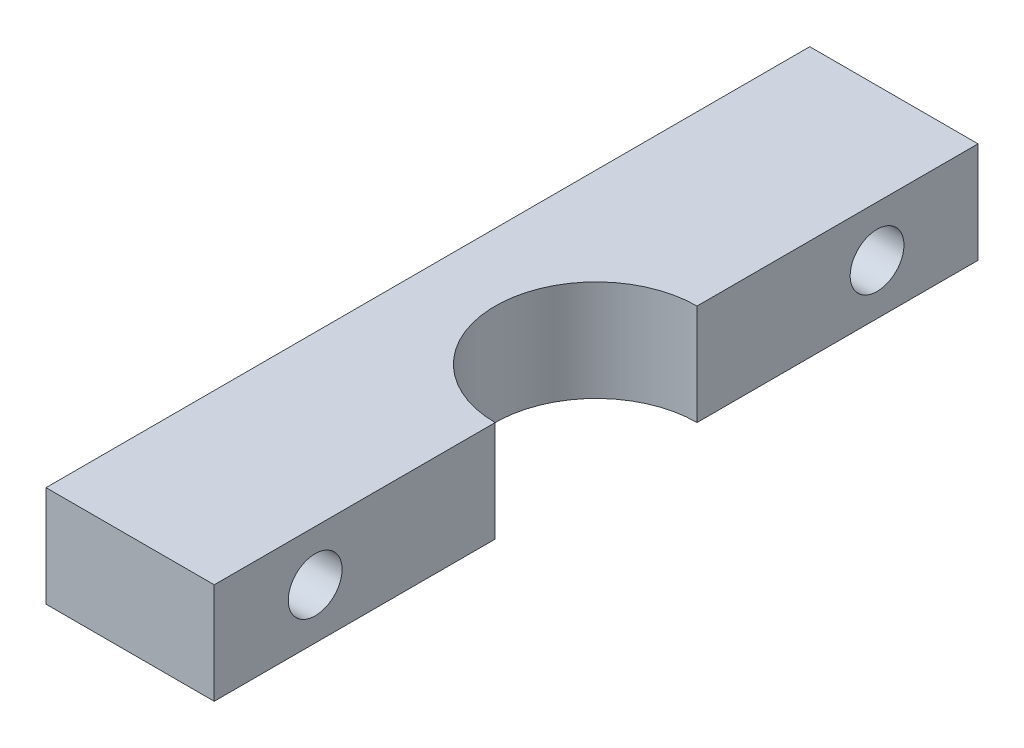
ISO-10303-21;
HEADER;
FILE_DESCRIPTION(('STEP AP214'),'2;1');
FILE_NAME('part.step','',(''),(''),'','','');
FILE_SCHEMA(('AUTOMOTIVE_DESIGN { 1 0 10303 214 1 1 1 1 }'));
ENDSEC;
DATA;
#1=APPLICATION_CONTEXT('core data for automotive mechanical design processes');
#2=APPLICATION_PROTOCOL_DEFINITION('international standard','automotive_design',2000,#1);
#3=PRODUCT_CONTEXT('',#1,'mechanical');
#4=PRODUCT('Part','Part','',(#3));
#5=PRODUCT_RELATED_PRODUCT_CATEGORY('part','',(#4));
#6=PRODUCT_DEFINITION_FORMATION('','',#4);
#7=PRODUCT_DEFINITION_CONTEXT('part definition',#1,'design');
#8=PRODUCT_DEFINITION('design','',#6,#7);
#9=PRODUCT_DEFINITION_SHAPE('','',#8);
#10=(LENGTH_UNIT() NAMED_UNIT(*) SI_UNIT(.MILLI.,.METRE.));
#11=(NAMED_UNIT(*) PLANE_ANGLE_UNIT() SI_UNIT($,.RADIAN.));
#12=(NAMED_UNIT(*) SI_UNIT($,.STERADIAN.) SOLID_ANGLE_UNIT());
#13=UNCERTAINTY_MEASURE_WITH_UNIT(LENGTH_MEASURE(1.E-05),#10,'distance_accuracy_value','');
#14=(GEOMETRIC_REPRESENTATION_CONTEXT(3) GLOBAL_UNCERTAINTY_ASSIGNED_CONTEXT((#13)) GLOBAL_UNIT_ASSIGNED_CONTEXT((#10,
#11,#12)) REPRESENTATION_CONTEXT('',''));
#15=CARTESIAN_POINT('',(0.,0.,0.));
#16=DIRECTION('',(0.,0.,1.));
#17=DIRECTION('',(1.,0.,0.));
#18=AXIS2_PLACEMENT_3D('',#15,#16,#17);
#19=CARTESIAN_POINT('',(0.,6.,0.));
#20=DIRECTION('',(1.,0.,0.));
#21=DIRECTION('',(0.,0.,-1.));
#22=AXIS2_PLACEMENT_3D('',#19,#20,#21);
#23=PLANE('',#22);
#24=CARTESIAN_POINT('',(0.,3.,-6.));
#25=DIRECTION('',(-1.,0.,0.));
#26=DIRECTION('',(0.,0.,1.));
#27=AXIS2_PLACEMENT_3D('',#24,#25,#26);
#28=CIRCLE('',#27,1.59999999999999);
#29=CARTESIAN_POINT('',(0.,3.,-4.40000000000001));
#30=VERTEX_POINT('',#29);
#31=EDGE_CURVE('E165',#30,#30,#28,.T.);
#32=ORIENTED_EDGE('',*,*,#31,.F.);
#33=EDGE_LOOP('',(#32));
#34=FACE_BOUND('',#33,.T.);
#35=DIRECTION('',(0.,0.,1.));
#36=VECTOR('',#35,1.);
#37=CARTESIAN_POINT('',(0.,0.,0.));
#38=LINE('',#37,#36);
#39=CARTESIAN_POINT('',(0.,0.,-45.4));
#40=VERTEX_POINT('',#39);
#41=CARTESIAN_POINT('',(0.,0.,0.));
#42=VERTEX_POINT('',#41);
#43=EDGE_CURVE('E121',#40,#42,#38,.T.);
#44=ORIENTED_EDGE('',*,*,#43,.T.);
#45=DIRECTION('',(0.,-1.,0.));
#46=VECTOR('',#45,1.);
#47=CARTESIAN_POINT('',(0.,6.,0.));
#48=LINE('',#47,#46);
#49=CARTESIAN_POINT('',(0.,6.,0.));
#50=VERTEX_POINT('',#49);
#51=EDGE_CURVE('E11',#50,#42,#48,.T.);
#52=ORIENTED_EDGE('',*,*,#51,.F.);
#53=DIRECTION('',(0.,0.,1.));
#54=VECTOR('',#53,1.);
#55=CARTESIAN_POINT('',(0.,6.,0.));
#56=LINE('',#55,#54);
#57=CARTESIAN_POINT('',(0.,6.,-45.4));
#58=VERTEX_POINT('',#57);
#59=EDGE_CURVE('E132',#58,#50,#56,.T.);
#60=ORIENTED_EDGE('',*,*,#59,.F.);
#61=DIRECTION('',(0.,-1.,0.));
#62=VECTOR('',#61,1.);
#63=CARTESIAN_POINT('',(0.,6.,-45.4));
#64=LINE('',#63,#62);
#65=EDGE_CURVE('E117',#58,#40,#64,.T.);
#66=ORIENTED_EDGE('',*,*,#65,.T.);
#67=EDGE_LOOP('',(#44,#52,#60,#66));
#68=FACE_BOUND('',#67,.T.);
#69=CARTESIAN_POINT('',(0.,3.,-39.4));
#70=DIRECTION('',(-1.,0.,0.));
#71=DIRECTION('',(0.,0.,1.));
#72=AXIS2_PLACEMENT_3D('',#69,#70,#71);
#73=CIRCLE('',#72,1.59999999999999);
#74=CARTESIAN_POINT('',(0.,3.,-37.8));
#75=VERTEX_POINT('',#74);
#76=EDGE_CURVE('E170',#75,#75,#73,.T.);
#77=ORIENTED_EDGE('',*,*,#76,.F.);
#78=EDGE_LOOP('',(#77));
#79=FACE_BOUND('',#78,.T.);
#80=ADVANCED_FACE('F37',(#34,#68,#79),#23,.F.);
#81=CARTESIAN_POINT('',(0.,6.,0.));
#82=DIRECTION('',(0.,0.,-1.));
#83=DIRECTION('',(-1.,0.,0.));
#84=AXIS2_PLACEMENT_3D('',#81,#82,#83);
#85=PLANE('',#84);
#86=DIRECTION('',(1.,0.,0.));
#87=VECTOR('',#86,1.);
#88=CARTESIAN_POINT('',(0.,0.,0.));
#89=LINE('',#88,#87);
#90=CARTESIAN_POINT('',(10.,0.,0.));
#91=VERTEX_POINT('',#90);
#92=EDGE_CURVE('E124',#42,#91,#89,.T.);
#93=ORIENTED_EDGE('',*,*,#92,.T.);
#94=DIRECTION('',(0.,-1.,0.));
#95=VECTOR('',#94,1.);
#96=CARTESIAN_POINT('',(10.,6.,0.));
#97=LINE('',#96,#95);
#98=CARTESIAN_POINT('',(10.,6.,0.));
#99=VERTEX_POINT('',#98);
#100=EDGE_CURVE('E45',#99,#91,#97,.T.);
#101=ORIENTED_EDGE('',*,*,#100,.F.);
#102=DIRECTION('',(1.,0.,0.));
#103=VECTOR('',#102,1.);
#104=CARTESIAN_POINT('',(0.,6.,0.));
#105=LINE('',#104,#103);
#106=EDGE_CURVE('E90',#50,#99,#105,.T.);
#107=ORIENTED_EDGE('',*,*,#106,.F.);
#108=ORIENTED_EDGE('',*,*,#51,.T.);
#109=EDGE_LOOP('',(#93,#101,#107,#108));
#110=FACE_BOUND('',#109,.T.);
#111=ADVANCED_FACE('F158',(#110),#85,.F.);
#112=CARTESIAN_POINT('',(10.,6.,0.));
#113=DIRECTION('',(-1.,0.,0.));
#114=DIRECTION('',(0.,0.,1.));
#115=AXIS2_PLACEMENT_3D('',#112,#113,#114);
#116=PLANE('',#115);
#117=CARTESIAN_POINT('',(10.,3.,-6.));
#118=DIRECTION('',(-1.,0.,0.));
#119=DIRECTION('',(0.,0.,1.));
#120=AXIS2_PLACEMENT_3D('',#117,#118,#119);
#121=CIRCLE('',#120,1.6);
#122=CARTESIAN_POINT('',(10.,3.,-4.4));
#123=VERTEX_POINT('',#122);
#124=EDGE_CURVE('E167',#123,#123,#121,.T.);
#125=ORIENTED_EDGE('',*,*,#124,.T.);
#126=EDGE_LOOP('',(#125));
#127=FACE_BOUND('',#126,.T.);
#128=DIRECTION('',(0.,0.,-1.));
#129=VECTOR('',#128,1.);
#130=CARTESIAN_POINT('',(10.,0.,0.));
#131=LINE('',#130,#129);
#132=CARTESIAN_POINT('',(10.,0.,-16.7));
#133=VERTEX_POINT('',#132);
#134=EDGE_CURVE('E127',#91,#133,#131,.T.);
#135=ORIENTED_EDGE('',*,*,#134,.T.);
#136=DIRECTION('',(0.,-1.,0.));
#137=VECTOR('',#136,1.);
#138=CARTESIAN_POINT('',(10.,6.,-16.7));
#139=LINE('',#138,#137);
#140=CARTESIAN_POINT('',(10.,6.,-16.7));
#141=VERTEX_POINT('',#140);
#142=EDGE_CURVE('E112',#141,#133,#139,.T.);
#143=ORIENTED_EDGE('',*,*,#142,.F.);
#144=DIRECTION('',(0.,0.,-1.));
#145=VECTOR('',#144,1.);
#146=CARTESIAN_POINT('',(10.,6.,0.));
#147=LINE('',#146,#145);
#148=EDGE_CURVE('E103',#99,#141,#147,.T.);
#149=ORIENTED_EDGE('',*,*,#148,.F.);
#150=ORIENTED_EDGE('',*,*,#100,.T.);
#151=EDGE_LOOP('',(#135,#143,#149,#150));
#152=FACE_BOUND('',#151,.T.);
#153=ADVANCED_FACE('F138',(#127,#152),#116,.F.);
#154=CARTESIAN_POINT('',(10.,6.,-22.7));
#155=DIRECTION('',(0.,-1.,0.));
#156=DIRECTION('',(0.,0.,-1.));
#157=AXIS2_PLACEMENT_3D('',#154,#155,#156);
#158=CYLINDRICAL_SURFACE('',#157,6.);
#159=CARTESIAN_POINT('',(10.,0.,-22.7));
#160=DIRECTION('',(0.,-1.,0.));
#161=DIRECTION('',(0.,0.,1.));
#162=AXIS2_PLACEMENT_3D('',#159,#160,#161);
#163=CIRCLE('',#162,6.);
#164=CARTESIAN_POINT('',(10.,0.,-28.7));
#165=VERTEX_POINT('',#164);
#166=EDGE_CURVE('E111',#133,#165,#163,.T.);
#167=ORIENTED_EDGE('',*,*,#166,.T.);
#168=DIRECTION('',(0.,-1.,0.));
#169=VECTOR('',#168,1.);
#170=CARTESIAN_POINT('',(10.,6.,-28.7));
#171=LINE('',#170,#169);
#172=CARTESIAN_POINT('',(10.,6.,-28.7));
#173=VERTEX_POINT('',#172);
#174=EDGE_CURVE('E108',#173,#165,#171,.T.);
#175=ORIENTED_EDGE('',*,*,#174,.F.);
#176=CARTESIAN_POINT('',(10.,6.,-22.7));
#177=DIRECTION('',(0.,-1.,0.));
#178=DIRECTION('',(0.,0.,1.));
#179=AXIS2_PLACEMENT_3D('',#176,#177,#178);
#180=CIRCLE('',#179,6.);
#181=EDGE_CURVE('E97',#141,#173,#180,.T.);
#182=ORIENTED_EDGE('',*,*,#181,.F.);
#183=ORIENTED_EDGE('',*,*,#142,.T.);
#184=EDGE_LOOP('',(#167,#175,#182,#183));
#185=FACE_BOUND('',#184,.T.);
#186=ADVANCED_FACE('F109',(#185),#158,.F.);
#187=CARTESIAN_POINT('',(10.,6.,-28.7));
#188=DIRECTION('',(-1.,0.,0.));
#189=DIRECTION('',(0.,0.,1.));
#190=AXIS2_PLACEMENT_3D('',#187,#188,#189);
#191=PLANE('',#190);
#192=CARTESIAN_POINT('',(10.,3.,-39.4));
#193=DIRECTION('',(-1.,0.,0.));
#194=DIRECTION('',(0.,0.,1.));
#195=AXIS2_PLACEMENT_3D('',#192,#193,#194);
#196=CIRCLE('',#195,1.6);
#197=CARTESIAN_POINT('',(10.,3.,-37.8));
#198=VERTEX_POINT('',#197);
#199=EDGE_CURVE('E125',#198,#198,#196,.T.);
#200=ORIENTED_EDGE('',*,*,#199,.T.);
#201=EDGE_LOOP('',(#200));
#202=FACE_BOUND('',#201,.T.);
#203=DIRECTION('',(0.,0.,-1.));
#204=VECTOR('',#203,1.);
#205=CARTESIAN_POINT('',(10.,0.,-28.7));
#206=LINE('',#205,#204);
#207=CARTESIAN_POINT('',(10.,0.,-45.4));
#208=VERTEX_POINT('',#207);
#209=EDGE_CURVE('E76',#165,#208,#206,.T.);
#210=ORIENTED_EDGE('',*,*,#209,.T.);
#211=DIRECTION('',(0.,-1.,0.));
#212=VECTOR('',#211,1.);
#213=CARTESIAN_POINT('',(10.,6.,-45.4));
#214=LINE('',#213,#212);
#215=CARTESIAN_POINT('',(10.,6.,-45.4));
#216=VERTEX_POINT('',#215);
#217=EDGE_CURVE('E113',#216,#208,#214,.T.);
#218=ORIENTED_EDGE('',*,*,#217,.F.);
#219=DIRECTION('',(0.,0.,-1.));
#220=VECTOR('',#219,1.);
#221=CARTESIAN_POINT('',(10.,6.,-28.7));
#222=LINE('',#221,#220);
#223=EDGE_CURVE('E101',#173,#216,#222,.T.);
#224=ORIENTED_EDGE('',*,*,#223,.F.);
#225=ORIENTED_EDGE('',*,*,#174,.T.);
#226=EDGE_LOOP('',(#210,#218,#224,#225));
#227=FACE_BOUND('',#226,.T.);
#228=ADVANCED_FACE('F115',(#202,#227),#191,.F.);
#229=CARTESIAN_POINT('',(0.,6.,-45.4));
#230=DIRECTION('',(0.,0.,1.));
#231=DIRECTION('',(1.,0.,0.));
#232=AXIS2_PLACEMENT_3D('',#229,#230,#231);
#233=PLANE('',#232);
#234=DIRECTION('',(-1.,0.,0.));
#235=VECTOR('',#234,1.);
#236=CARTESIAN_POINT('',(0.,0.,-45.4));
#237=LINE('',#236,#235);
#238=EDGE_CURVE('E82',#208,#40,#237,.T.);
#239=ORIENTED_EDGE('',*,*,#238,.T.);
#240=ORIENTED_EDGE('',*,*,#65,.F.);
#241=DIRECTION('',(-1.,0.,0.));
#242=VECTOR('',#241,1.);
#243=CARTESIAN_POINT('',(0.,6.,-45.4));
#244=LINE('',#243,#242);
#245=EDGE_CURVE('E53',#216,#58,#244,.T.);
#246=ORIENTED_EDGE('',*,*,#245,.F.);
#247=ORIENTED_EDGE('',*,*,#217,.T.);
#248=EDGE_LOOP('',(#239,#240,#246,#247));
#249=FACE_BOUND('',#248,.T.);
#250=ADVANCED_FACE('F146',(#249),#233,.F.);
#251=CARTESIAN_POINT('',(10.,6.,-22.7));
#252=DIRECTION('',(0.,1.,0.));
#253=DIRECTION('',(0.,0.,1.));
#254=AXIS2_PLACEMENT_3D('',#251,#252,#253);
#255=PLANE('',#254);
#256=ORIENTED_EDGE('',*,*,#59,.T.);
#257=ORIENTED_EDGE('',*,*,#106,.T.);
#258=ORIENTED_EDGE('',*,*,#148,.T.);
#259=ORIENTED_EDGE('',*,*,#181,.T.);
#260=ORIENTED_EDGE('',*,*,#223,.T.);
#261=ORIENTED_EDGE('',*,*,#245,.T.);
#262=EDGE_LOOP('',(#256,#257,#258,#259,#260,#261));
#263=FACE_BOUND('',#262,.T.);
#264=ADVANCED_FACE('F99',(#263),#255,.T.);
#265=CARTESIAN_POINT('',(10.,0.,-22.7));
#266=DIRECTION('',(0.,1.,0.));
#267=DIRECTION('',(0.,0.,1.));
#268=AXIS2_PLACEMENT_3D('',#265,#266,#267);
#269=PLANE('',#268);
#270=ORIENTED_EDGE('',*,*,#43,.F.);
#271=ORIENTED_EDGE('',*,*,#238,.F.);
#272=ORIENTED_EDGE('',*,*,#209,.F.);
#273=ORIENTED_EDGE('',*,*,#166,.F.);
#274=ORIENTED_EDGE('',*,*,#134,.F.);
#275=ORIENTED_EDGE('',*,*,#92,.F.);
#276=EDGE_LOOP('',(#270,#271,#272,#273,#274,#275));
#277=FACE_BOUND('',#276,.T.);
#278=ADVANCED_FACE('F141',(#277),#269,.F.);
#279=CARTESIAN_POINT('',(0.,3.,-39.4));
#280=DIRECTION('',(-1.,0.,0.));
#281=DIRECTION('',(0.,0.,1.));
#282=AXIS2_PLACEMENT_3D('',#279,#280,#281);
#283=CYLINDRICAL_SURFACE('',#282,1.59999999999999);
#284=ORIENTED_EDGE('',*,*,#199,.F.);
#285=EDGE_LOOP('',(#284));
#286=FACE_BOUND('',#285,.T.);
#287=ORIENTED_EDGE('',*,*,#76,.T.);
#288=EDGE_LOOP('',(#287));
#289=FACE_BOUND('',#288,.T.);
#290=ADVANCED_FACE('F180',(#286,#289),#283,.F.);
#291=CARTESIAN_POINT('',(0.,3.,-6.));
#292=DIRECTION('',(-1.,0.,0.));
#293=DIRECTION('',(0.,0.,1.));
#294=AXIS2_PLACEMENT_3D('',#291,#292,#293);
#295=CYLINDRICAL_SURFACE('',#294,1.59999999999999);
#296=ORIENTED_EDGE('',*,*,#124,.F.);
#297=EDGE_LOOP('',(#296));
#298=FACE_BOUND('',#297,.T.);
#299=ORIENTED_EDGE('',*,*,#31,.T.);
#300=EDGE_LOOP('',(#299));
#301=FACE_BOUND('',#300,.T.);
#302=ADVANCED_FACE('F183',(#298,#301),#295,.F.);
#303=CLOSED_SHELL('',(#80,#111,#153,#186,#228,#250,#264,#278,#290,#302));
#304=MANIFOLD_SOLID_BREP('B2',#303);
#305=ADVANCED_BREP_SHAPE_REPRESENTATION('',(#18,#304),#14);
#306=SHAPE_DEFINITION_REPRESENTATION(#9,#305);
ENDSEC;
END-ISO-10303-21;
